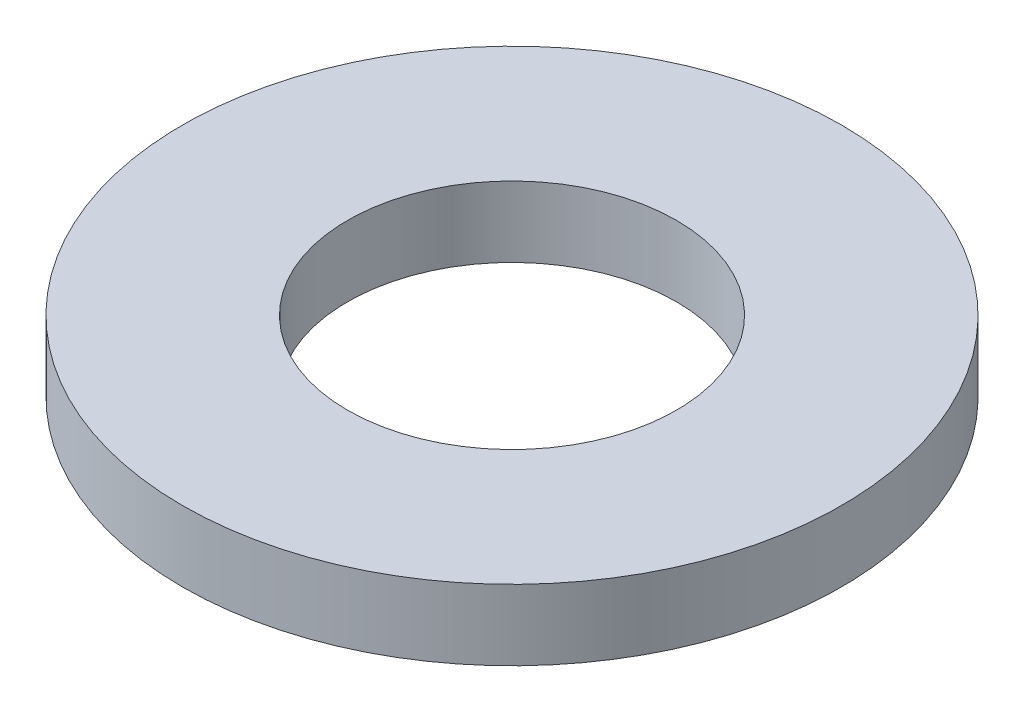
ISO-10303-21;
HEADER;
FILE_DESCRIPTION(('STEP AP214'),'2;1');
FILE_NAME('part.step','',(''),(''),'','','');
FILE_SCHEMA(('AUTOMOTIVE_DESIGN { 1 0 10303 214 1 1 1 1 }'));
ENDSEC;
DATA;
#1=APPLICATION_CONTEXT('core data for automotive mechanical design processes');
#2=APPLICATION_PROTOCOL_DEFINITION('international standard','automotive_design',2000,#1);
#3=PRODUCT_CONTEXT('',#1,'mechanical');
#4=PRODUCT('Part','Part','',(#3));
#5=PRODUCT_RELATED_PRODUCT_CATEGORY('part','',(#4));
#6=PRODUCT_DEFINITION_FORMATION('','',#4);
#7=PRODUCT_DEFINITION_CONTEXT('part definition',#1,'design');
#8=PRODUCT_DEFINITION('design','',#6,#7);
#9=PRODUCT_DEFINITION_SHAPE('','',#8);
#10=(LENGTH_UNIT() NAMED_UNIT(*) SI_UNIT(.MILLI.,.METRE.));
#11=(NAMED_UNIT(*) PLANE_ANGLE_UNIT() SI_UNIT($,.RADIAN.));
#12=(NAMED_UNIT(*) SI_UNIT($,.STERADIAN.) SOLID_ANGLE_UNIT());
#13=UNCERTAINTY_MEASURE_WITH_UNIT(LENGTH_MEASURE(1.E-05),#10,'distance_accuracy_value','');
#14=(GEOMETRIC_REPRESENTATION_CONTEXT(3) GLOBAL_UNCERTAINTY_ASSIGNED_CONTEXT((#13)) GLOBAL_UNIT_ASSIGNED_CONTEXT((#10,
#11,#12)) REPRESENTATION_CONTEXT('',''));
#15=CARTESIAN_POINT('',(0.,0.,0.));
#16=DIRECTION('',(0.,0.,1.));
#17=DIRECTION('',(1.,0.,0.));
#18=AXIS2_PLACEMENT_3D('',#15,#16,#17);
#19=CARTESIAN_POINT('',(0.,0.9652,0.));
#20=DIRECTION('',(0.,-1.,0.));
#21=DIRECTION('',(0.,0.,-1.));
#22=AXIS2_PLACEMENT_3D('',#19,#20,#21);
#23=CYLINDRICAL_SURFACE('',#22,4.5085);
#24=CARTESIAN_POINT('',(0.,0.9652,0.));
#25=DIRECTION('',(0.,1.,0.));
#26=DIRECTION('',(0.,0.,1.));
#27=AXIS2_PLACEMENT_3D('',#24,#25,#26);
#28=CIRCLE('',#27,4.5085);
#29=CARTESIAN_POINT('',(0.,0.9652,-4.5085));
#30=VERTEX_POINT('',#29);
#31=EDGE_CURVE('E10',#30,#30,#28,.T.);
#32=CARTESIAN_POINT('',(0.,0.,0.));
#33=DIRECTION('',(0.,1.,0.));
#34=DIRECTION('',(0.,0.,1.));
#35=AXIS2_PLACEMENT_3D('',#32,#33,#34);
#36=CIRCLE('',#35,4.5085);
#37=CARTESIAN_POINT('',(0.,0.,-4.5085));
#38=VERTEX_POINT('',#37);
#39=EDGE_CURVE('E36',#38,#38,#36,.T.);
#40=CARTESIAN_POINT('',(0.,0.9652,-4.5085));
#41=CARTESIAN_POINT('',(0.,0.955145833333333,-4.5085));
#42=CARTESIAN_POINT('',(0.,0.945091666666667,-4.5085));
#43=CARTESIAN_POINT('',(0.,0.924983333333333,-4.5085));
#44=CARTESIAN_POINT('',(0.,0.914929166666667,-4.5085));
#45=CARTESIAN_POINT('',(0.,0.894820833333333,-4.5085));
#46=CARTESIAN_POINT('',(0.,0.884766666666667,-4.5085));
#47=CARTESIAN_POINT('',(0.,0.864658333333333,-4.5085));
#48=CARTESIAN_POINT('',(0.,0.854604166666667,-4.5085));
#49=CARTESIAN_POINT('',(0.,0.834495833333333,-4.5085));
#50=CARTESIAN_POINT('',(0.,0.824441666666667,-4.5085));
#51=CARTESIAN_POINT('',(0.,0.804333333333333,-4.5085));
#52=CARTESIAN_POINT('',(0.,0.794279166666667,-4.5085));
#53=CARTESIAN_POINT('',(0.,0.774170833333333,-4.5085));
#54=CARTESIAN_POINT('',(0.,0.764116666666667,-4.5085));
#55=CARTESIAN_POINT('',(0.,0.744008333333333,-4.5085));
#56=CARTESIAN_POINT('',(0.,0.733954166666667,-4.5085));
#57=CARTESIAN_POINT('',(0.,0.713845833333333,-4.5085));
#58=CARTESIAN_POINT('',(0.,0.703791666666667,-4.5085));
#59=CARTESIAN_POINT('',(0.,0.683683333333333,-4.5085));
#60=CARTESIAN_POINT('',(0.,0.673629166666667,-4.5085));
#61=CARTESIAN_POINT('',(0.,0.653520833333333,-4.5085));
#62=CARTESIAN_POINT('',(0.,0.643466666666667,-4.5085));
#63=CARTESIAN_POINT('',(0.,0.623358333333333,-4.5085));
#64=CARTESIAN_POINT('',(0.,0.613304166666667,-4.5085));
#65=CARTESIAN_POINT('',(0.,0.593195833333333,-4.5085));
#66=CARTESIAN_POINT('',(0.,0.583141666666667,-4.5085));
#67=CARTESIAN_POINT('',(0.,0.563033333333333,-4.5085));
#68=CARTESIAN_POINT('',(0.,0.552979166666667,-4.5085));
#69=CARTESIAN_POINT('',(0.,0.532870833333333,-4.5085));
#70=CARTESIAN_POINT('',(0.,0.522816666666667,-4.5085));
#71=CARTESIAN_POINT('',(0.,0.502708333333333,-4.5085));
#72=CARTESIAN_POINT('',(0.,0.492654166666667,-4.5085));
#73=CARTESIAN_POINT('',(0.,0.472545833333333,-4.5085));
#74=CARTESIAN_POINT('',(0.,0.462491666666667,-4.5085));
#75=CARTESIAN_POINT('',(0.,0.442383333333333,-4.5085));
#76=CARTESIAN_POINT('',(0.,0.432329166666667,-4.5085));
#77=CARTESIAN_POINT('',(0.,0.412220833333333,-4.5085));
#78=CARTESIAN_POINT('',(0.,0.402166666666667,-4.5085));
#79=CARTESIAN_POINT('',(0.,0.382058333333333,-4.5085));
#80=CARTESIAN_POINT('',(0.,0.372004166666667,-4.5085));
#81=CARTESIAN_POINT('',(0.,0.351895833333333,-4.5085));
#82=CARTESIAN_POINT('',(0.,0.341841666666667,-4.5085));
#83=CARTESIAN_POINT('',(0.,0.321733333333333,-4.5085));
#84=CARTESIAN_POINT('',(0.,0.311679166666667,-4.5085));
#85=CARTESIAN_POINT('',(0.,0.291570833333333,-4.5085));
#86=CARTESIAN_POINT('',(0.,0.281516666666667,-4.5085));
#87=CARTESIAN_POINT('',(0.,0.261408333333333,-4.5085));
#88=CARTESIAN_POINT('',(0.,0.251354166666667,-4.5085));
#89=CARTESIAN_POINT('',(0.,0.231245833333333,-4.5085));
#90=CARTESIAN_POINT('',(0.,0.221191666666667,-4.5085));
#91=CARTESIAN_POINT('',(0.,0.201083333333333,-4.5085));
#92=CARTESIAN_POINT('',(0.,0.191029166666667,-4.5085));
#93=CARTESIAN_POINT('',(0.,0.170920833333333,-4.5085));
#94=CARTESIAN_POINT('',(0.,0.160866666666667,-4.5085));
#95=CARTESIAN_POINT('',(0.,0.140758333333333,-4.5085));
#96=CARTESIAN_POINT('',(0.,0.130704166666667,-4.5085));
#97=CARTESIAN_POINT('',(0.,0.110595833333333,-4.5085));
#98=CARTESIAN_POINT('',(0.,0.100541666666667,-4.5085));
#99=CARTESIAN_POINT('',(0.,0.0804333333333333,-4.5085));
#100=CARTESIAN_POINT('',(0.,0.0703791666666666,-4.5085));
#101=CARTESIAN_POINT('',(0.,0.0502708333333333,-4.5085));
#102=CARTESIAN_POINT('',(0.,0.0402166666666666,-4.5085));
#103=CARTESIAN_POINT('',(0.,0.0201083333333333,-4.5085));
#104=CARTESIAN_POINT('',(0.,0.0100541666666667,-4.5085));
#105=CARTESIAN_POINT('',(0.,0.,-4.5085));
#106=B_SPLINE_CURVE_WITH_KNOTS('',3,(#40,#41,#42,#43,#44,#45,#46,#47,#48,#49,#50,#51,#52,#53,
#54,#55,#56,#57,#58,#59,#60,#61,#62,#63,#64,#65,#66,#67,#68,#69,#70,#71,#72,#73,#74,#75,#76,#77,
#78,#79,#80,#81,#82,#83,#84,#85,#86,#87,#88,#89,#90,#91,#92,#93,#94,#95,#96,#97,#98,#99,#100,
#101,#102,#103,#104,#105),.UNSPECIFIED.,.F.,.F.,(4,2,2,2,2,2,2,2,2,2,2,2,2,2,2,2,2,2,2,2,2,2,2,
2,2,2,2,2,2,2,2,2,4),(0.,0.0301625,0.060325,0.0904874999999999,0.12065,0.1508125,0.180975,
0.2111375,0.2413,0.2714625,0.301625,0.3317875,0.36195,0.3921125,0.422275,0.4524375,0.4826,
0.5127625,0.542925,0.5730875,0.60325,0.6334125,0.663575,0.6937375,0.7239,0.7540625,0.784225,
0.8143875,0.84455,0.8747125,0.904875,0.9350375,0.9652),.UNSPECIFIED.);
#107=EDGE_CURVE('BSEAM33',#30,#38,#106,.T.);
#108=ORIENTED_EDGE('',*,*,#31,.F.);
#109=ORIENTED_EDGE('',*,*,#39,.T.);
#110=ORIENTED_EDGE('',*,*,#107,.T.);
#111=ORIENTED_EDGE('',*,*,#107,.F.);
#112=EDGE_LOOP('',(#108,#110,#109,#111));
#113=FACE_BOUND('',#112,.T.);
#114=ADVANCED_FACE('F33',(#113),#23,.T.);
#115=CARTESIAN_POINT('',(0.,0.9652,0.));
#116=DIRECTION('',(0.,1.,0.));
#117=DIRECTION('',(0.,0.,1.));
#118=AXIS2_PLACEMENT_3D('',#115,#116,#117);
#119=PLANE('',#118);
#120=CARTESIAN_POINT('',(0.,0.9652,0.));
#121=DIRECTION('',(0.,1.,0.));
#122=DIRECTION('',(0.,0.,1.));
#123=AXIS2_PLACEMENT_3D('',#120,#121,#122);
#124=CIRCLE('',#123,2.25);
#125=CARTESIAN_POINT('',(0.,0.9652,2.25));
#126=VERTEX_POINT('',#125);
#127=EDGE_CURVE('E47',#126,#126,#124,.T.);
#128=ORIENTED_EDGE('',*,*,#127,.F.);
#129=EDGE_LOOP('',(#128));
#130=FACE_BOUND('',#129,.T.);
#131=ORIENTED_EDGE('',*,*,#31,.T.);
#132=EDGE_LOOP('',(#131));
#133=FACE_BOUND('',#132,.T.);
#134=ADVANCED_FACE('F53',(#130,#133),#119,.T.);
#135=CARTESIAN_POINT('',(0.,0.,0.));
#136=DIRECTION('',(0.,1.,0.));
#137=DIRECTION('',(0.,0.,1.));
#138=AXIS2_PLACEMENT_3D('',#135,#136,#137);
#139=PLANE('',#138);
#140=CARTESIAN_POINT('',(0.,0.,0.));
#141=DIRECTION('',(0.,1.,0.));
#142=DIRECTION('',(0.,0.,1.));
#143=AXIS2_PLACEMENT_3D('',#140,#141,#142);
#144=CIRCLE('',#143,2.25);
#145=CARTESIAN_POINT('',(0.,0.,2.25));
#146=VERTEX_POINT('',#145);
#147=EDGE_CURVE('E43',#146,#146,#144,.T.);
#148=ORIENTED_EDGE('',*,*,#147,.T.);
#149=EDGE_LOOP('',(#148));
#150=FACE_BOUND('',#149,.T.);
#151=ORIENTED_EDGE('',*,*,#39,.F.);
#152=EDGE_LOOP('',(#151));
#153=FACE_BOUND('',#152,.T.);
#154=ADVANCED_FACE('F55',(#150,#153),#139,.F.);
#155=CARTESIAN_POINT('',(0.,0.9652,0.));
#156=DIRECTION('',(0.,1.,0.));
#157=DIRECTION('',(0.,0.,1.));
#158=AXIS2_PLACEMENT_3D('',#155,#156,#157);
#159=CYLINDRICAL_SURFACE('',#158,2.25);
#160=ORIENTED_EDGE('',*,*,#147,.F.);
#161=EDGE_LOOP('',(#160));
#162=FACE_BOUND('',#161,.T.);
#163=ORIENTED_EDGE('',*,*,#127,.T.);
#164=EDGE_LOOP('',(#163));
#165=FACE_BOUND('',#164,.T.);
#166=ADVANCED_FACE('F51',(#162,#165),#159,.F.);
#167=CLOSED_SHELL('',(#114,#134,#154,#166));
#168=MANIFOLD_SOLID_BREP('B2',#167);
#169=ADVANCED_BREP_SHAPE_REPRESENTATION('',(#18,#168),#14);
#170=SHAPE_DEFINITION_REPRESENTATION(#9,#169);
ENDSEC;
END-ISO-10303-21;
